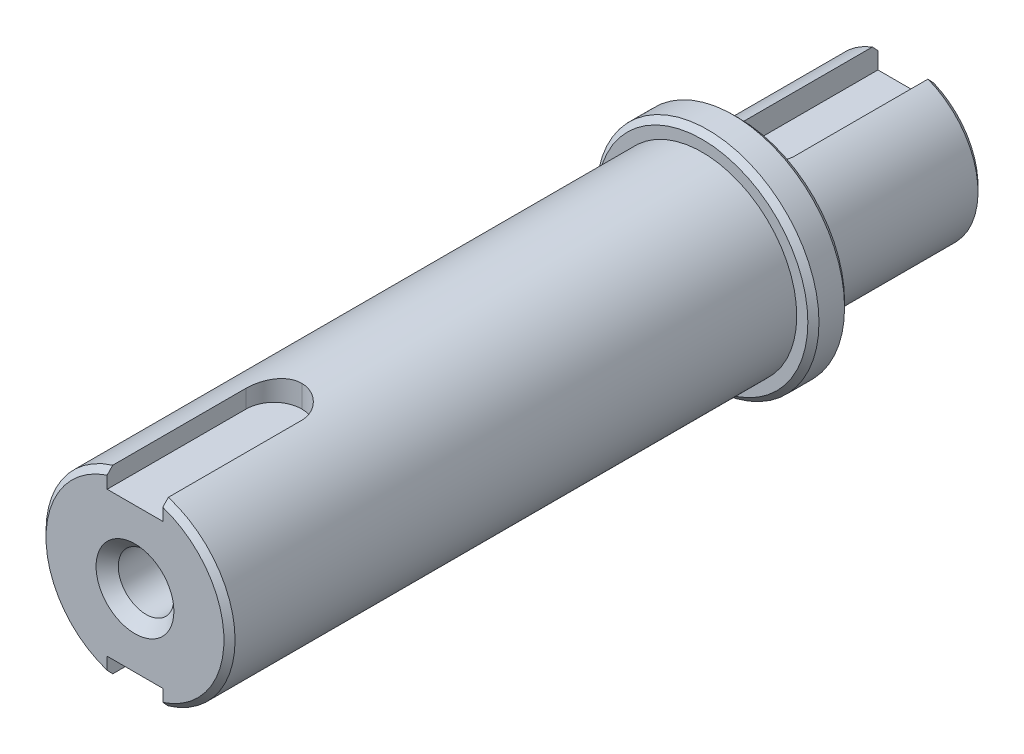
ISO-10303-21;
HEADER;
FILE_DESCRIPTION(('STEP AP214'),'2;1');
FILE_NAME('part.step','',(''),(''),'','','');
FILE_SCHEMA(('AUTOMOTIVE_DESIGN { 1 0 10303 214 1 1 1 1 }'));
ENDSEC;
DATA;
#1=APPLICATION_CONTEXT('core data for automotive mechanical design processes');
#2=APPLICATION_PROTOCOL_DEFINITION('international standard','automotive_design',2000,#1);
#3=PRODUCT_CONTEXT('',#1,'mechanical');
#4=PRODUCT('Part','Part','',(#3));
#5=PRODUCT_RELATED_PRODUCT_CATEGORY('part','',(#4));
#6=PRODUCT_DEFINITION_FORMATION('','',#4);
#7=PRODUCT_DEFINITION_CONTEXT('part definition',#1,'design');
#8=PRODUCT_DEFINITION('design','',#6,#7);
#9=PRODUCT_DEFINITION_SHAPE('','',#8);
#10=(LENGTH_UNIT() NAMED_UNIT(*) SI_UNIT(.MILLI.,.METRE.));
#11=(NAMED_UNIT(*) PLANE_ANGLE_UNIT() SI_UNIT($,.RADIAN.));
#12=(NAMED_UNIT(*) SI_UNIT($,.STERADIAN.) SOLID_ANGLE_UNIT());
#13=UNCERTAINTY_MEASURE_WITH_UNIT(LENGTH_MEASURE(1.E-05),#10,'distance_accuracy_value','');
#14=(GEOMETRIC_REPRESENTATION_CONTEXT(3) GLOBAL_UNCERTAINTY_ASSIGNED_CONTEXT((#13)) GLOBAL_UNIT_ASSIGNED_CONTEXT((#10,
#11,#12)) REPRESENTATION_CONTEXT('',''));
#15=CARTESIAN_POINT('',(0.,0.,0.));
#16=DIRECTION('',(0.,0.,1.));
#17=DIRECTION('',(1.,0.,0.));
#18=AXIS2_PLACEMENT_3D('',#15,#16,#17);
#19=CARTESIAN_POINT('',(0.,0.,69.3));
#20=DIRECTION('',(0.,0.,-1.));
#21=DIRECTION('',(-1.,0.,0.));
#22=AXIS2_PLACEMENT_3D('',#19,#20,#21);
#23=CONICAL_SURFACE('',#22,8.00000000000001,0.785398163397441);
#24=CARTESIAN_POINT('',(2.49999999999992,-10.8696270199437,66.1465793788322));
#25=CARTESIAN_POINT('',(2.49999999999993,-10.636859116482,66.3734218740203));
#26=CARTESIAN_POINT('',(2.49999999999993,-10.4039121897098,66.6000803486522));
#27=CARTESIAN_POINT('',(2.49999999999993,-9.93757307024405,67.0529384229988));
#28=CARTESIAN_POINT('',(2.49999999999993,-9.70418087783187,67.2791380230031));
#29=CARTESIAN_POINT('',(2.49999999999994,-9.00324050594073,67.9568784870172));
#30=CARTESIAN_POINT('',(2.49999999999994,-8.53489331918052,68.4075953844983));
#31=CARTESIAN_POINT('',(2.49999999999995,-7.82982222982861,69.0810369084252));
#32=CARTESIAN_POINT('',(2.49999999999995,-7.59436457285476,69.3050868281361));
#33=CARTESIAN_POINT('',(2.49999999999995,-7.12234637204195,69.7520182988378));
#34=CARTESIAN_POINT('',(2.49999999999995,-6.88578583860562,69.9748998608068));
#35=CARTESIAN_POINT('',(2.49999999999996,-6.41119187258631,70.4191289915092));
#36=CARTESIAN_POINT('',(2.49999999999996,-6.17315832800621,70.6404764408183));
#37=CARTESIAN_POINT('',(2.49999999999996,-5.81461841459231,70.9708892616053));
#38=CARTESIAN_POINT('',(2.49999999999996,-5.69485492358544,71.0807605477859));
#39=CARTESIAN_POINT('',(2.49999999999996,-5.45473492325932,71.2998551079489));
#40=CARTESIAN_POINT('',(2.49999999999996,-5.33437840875386,71.4090783762456));
#41=CARTESIAN_POINT('',(2.49999999999996,-5.21367756830305,71.5179213265275));
#42=B_SPLINE_CURVE_WITH_KNOTS('',3,(#24,#25,#26,#27,#28,#29,#30,#31,#32,#33,#34,#35,#36,#37,#38,
#39,#40,#41),.UNSPECIFIED.,.F.,.F.,(4,2,2,2,2,2,2,2,4),(0.,0.975061231478007,1.95012184704872,
3.90009546224326,4.87515566160608,5.85020668248621,6.82533277310804,7.31291135896617,
7.80049421646795),.UNSPECIFIED.);
#43=CARTESIAN_POINT('',(2.49999999999994,-8.12403840463598,68.8));
#44=VERTEX_POINT('',#43);
#45=CARTESIAN_POINT('',(2.49999999999995,-7.59934207678536,69.3));
#46=VERTEX_POINT('',#45);
#47=EDGE_CURVE('E171',#44,#46,#42,.T.);
#48=ORIENTED_EDGE('',*,*,#47,.F.);
#49=CARTESIAN_POINT('',(0.,0.,68.8));
#50=DIRECTION('',(0.,0.,1.));
#51=DIRECTION('',(1.,0.,0.));
#52=AXIS2_PLACEMENT_3D('',#49,#50,#51);
#53=CIRCLE('',#52,8.5);
#54=CARTESIAN_POINT('',(2.5,8.12403840463596,68.8));
#55=VERTEX_POINT('',#54);
#56=EDGE_CURVE('E328',#55,#44,#53,.F.);
#57=ORIENTED_EDGE('',*,*,#56,.F.);
#58=CARTESIAN_POINT('',(2.5,7.59934207678534,69.3));
#59=CARTESIAN_POINT('',(2.5,7.68691912734198,69.2168006317289));
#60=CARTESIAN_POINT('',(2.5,7.77443234738413,69.1335342801846));
#61=CARTESIAN_POINT('',(2.5,7.94933112332979,68.9668676135132));
#62=CARTESIAN_POINT('',(2.5,8.03671667923785,68.8834672983908));
#63=CARTESIAN_POINT('',(2.5,8.12403840463596,68.8));
#64=B_SPLINE_CURVE_WITH_KNOTS('',3,(#58,#59,#60,#61,#62,#63),.UNSPECIFIED.,.F.,.F.,(4,2,4),(0.,
0.362390177618984,0.724780342351574),.UNSPECIFIED.);
#65=CARTESIAN_POINT('',(2.5,7.59934207678534,69.3));
#66=VERTEX_POINT('',#65);
#67=EDGE_CURVE('E320',#66,#55,#64,.T.);
#68=ORIENTED_EDGE('',*,*,#67,.F.);
#69=CARTESIAN_POINT('',(0.,0.,69.3));
#70=DIRECTION('',(0.,0.,1.));
#71=DIRECTION('',(1.,0.,0.));
#72=AXIS2_PLACEMENT_3D('',#69,#70,#71);
#73=CIRCLE('',#72,8.00000000000001);
#74=EDGE_CURVE('E317',#46,#66,#73,.T.);
#75=ORIENTED_EDGE('',*,*,#74,.F.);
#76=EDGE_LOOP('',(#48,#57,#68,#75));
#77=FACE_BOUND('',#76,.T.);
#78=ADVANCED_FACE('F30',(#77),#23,.T.);
#79=CARTESIAN_POINT('',(0.,0.,15.));
#80=DIRECTION('',(0.,0.,-1.));
#81=DIRECTION('',(-1.,0.,0.));
#82=AXIS2_PLACEMENT_3D('',#79,#80,#81);
#83=CYLINDRICAL_SURFACE('',#82,7.);
#84=DIRECTION('',(0.,0.,-1.));
#85=VECTOR('',#84,1.);
#86=CARTESIAN_POINT('',(-2.5,6.53834841531101,15.));
#87=LINE('',#86,#85);
#88=CARTESIAN_POINT('',(-2.5,6.53834841531101,12.5));
#89=VERTEX_POINT('',#88);
#90=CARTESIAN_POINT('',(-2.5,6.53834841531101,0.499999999999978));
#91=VERTEX_POINT('',#90);
#92=EDGE_CURVE('E198',#89,#91,#87,.T.);
#93=ORIENTED_EDGE('',*,*,#92,.T.);
#94=CARTESIAN_POINT('',(0.,0.,0.499999999999978));
#95=DIRECTION('',(0.,0.,1.));
#96=DIRECTION('',(1.,0.,0.));
#97=AXIS2_PLACEMENT_3D('',#94,#95,#96);
#98=CIRCLE('',#97,7.);
#99=CARTESIAN_POINT('',(2.5,6.53834841531101,0.499999999999979));
#100=VERTEX_POINT('',#99);
#101=EDGE_CURVE('E353',#91,#100,#98,.T.);
#102=ORIENTED_EDGE('',*,*,#101,.T.);
#103=DIRECTION('',(0.,0.,-1.));
#104=VECTOR('',#103,1.);
#105=CARTESIAN_POINT('',(2.5,6.53834841531101,15.));
#106=LINE('',#105,#104);
#107=CARTESIAN_POINT('',(2.5,6.53834841531101,12.5));
#108=VERTEX_POINT('',#107);
#109=EDGE_CURVE('E203',#100,#108,#106,.F.);
#110=ORIENTED_EDGE('',*,*,#109,.T.);
#111=CARTESIAN_POINT('',(2.5,6.53834841531101,12.5));
#112=CARTESIAN_POINT('',(2.50000932444622,6.53833653584086,12.5678917606132));
#113=CARTESIAN_POINT('',(2.49723464622262,6.53940557744183,12.6357769639594));
#114=CARTESIAN_POINT('',(2.48618999898007,6.54361696384382,12.7710139079275));
#115=CARTESIAN_POINT('',(2.47792171332017,6.54675867353285,12.8383658055703));
#116=CARTESIAN_POINT('',(2.455999322543,6.55501308694937,12.9718337089638));
#117=CARTESIAN_POINT('',(2.44236338090026,6.56011914226912,13.0379531031587));
#118=CARTESIAN_POINT('',(2.4098497499207,6.57213229216529,13.1687066391195));
#119=CARTESIAN_POINT('',(2.39097182910556,6.57903946627573,13.2333407151593));
#120=CARTESIAN_POINT('',(2.32674044961539,6.60214905554765,13.4242619951042));
#121=CARTESIAN_POINT('',(2.27375315805254,6.62075405324683,13.5477858370217));
#122=CARTESIAN_POINT('',(2.14911019465095,6.66225312605043,13.7842261337117));
#123=CARTESIAN_POINT('',(2.07744023352399,6.68515048034755,13.8971343788978));
#124=CARTESIAN_POINT('',(1.91402689638811,6.73379882868167,14.1142138816347));
#125=CARTESIAN_POINT('',(1.82158634721561,6.75962796045009,14.2178438888859));
#126=CARTESIAN_POINT('',(1.6207356137859,6.81057540983754,14.4085068277013));
#127=CARTESIAN_POINT('',(1.51232208871062,6.83569357744193,14.495536278427));
#128=CARTESIAN_POINT('',(1.27850282117259,6.88331907970163,14.6531158225099));
#129=CARTESIAN_POINT('',(1.1526765067236,6.90572214958253,14.7230756711259));
#130=CARTESIAN_POINT('',(0.890147396905686,6.94443563272108,14.8405709598355));
#131=CARTESIAN_POINT('',(0.753455692686562,6.96075216451012,14.8881289322678));
#132=CARTESIAN_POINT('',(0.513511625377523,6.98185946377716,14.9488640177156));
#133=CARTESIAN_POINT('',(0.411899416502105,6.98861309237482,14.9679876709647));
#134=CARTESIAN_POINT('',(0.206881971872084,6.99770556810293,14.9935755518822));
#135=CARTESIAN_POINT('',(0.103476366088811,7.0000434929441,15.0000371348884));
#136=CARTESIAN_POINT('',(0.,7.,15.));
#137=B_SPLINE_CURVE_WITH_KNOTS('',3,(#111,#112,#113,#114,#115,#116,#117,#118,#119,#120,#121,
#122,#123,#124,#125,#126,#127,#128,#129,#130,#131,#132,#133,#134,#135,#136),.UNSPECIFIED.,.F.,
.F.,(4,2,2,2,2,2,2,2,2,2,2,2,4),(0.,0.203599169414438,0.407135980434992,0.609989888714329,
0.812852756157981,1.21792365461531,1.62330528194946,2.04515480156738,2.46709267844889,
2.90202857788652,3.33652606938374,3.64653458164688,3.95660783691393),.UNSPECIFIED.);
#138=CARTESIAN_POINT('',(0.,7.,15.));
#139=VERTEX_POINT('',#138);
#140=EDGE_CURVE('E289',#108,#139,#137,.T.);
#141=ORIENTED_EDGE('',*,*,#140,.T.);
#142=CARTESIAN_POINT('',(0.,0.,15.));
#143=DIRECTION('',(0.,0.,1.));
#144=DIRECTION('',(1.,0.,0.));
#145=AXIS2_PLACEMENT_3D('',#142,#143,#144);
#146=CIRCLE('',#145,7.);
#147=EDGE_CURVE('E228',#139,#139,#146,.T.);
#148=ORIENTED_EDGE('',*,*,#147,.F.);
#149=CARTESIAN_POINT('',(0.,7.,15.));
#150=CARTESIAN_POINT('',(-0.0680316354236911,7.00000923760042,15.0000089984849));
#151=CARTESIAN_POINT('',(-0.136057516067307,6.99900844265461,14.997223208249));
#152=CARTESIAN_POINT('',(-0.271584003896383,6.99505559924322,14.9861319263351));
#153=CARTESIAN_POINT('',(-0.33908473954282,6.99210404419495,14.9778278304321));
#154=CARTESIAN_POINT('',(-0.472878818341561,6.98433023755783,14.9558032078577));
#155=CARTESIAN_POINT('',(-0.539175203194543,6.97951368842146,14.94209918989));
#156=CARTESIAN_POINT('',(-0.670285587677925,6.9681457781704,14.9094165109746));
#157=CARTESIAN_POINT('',(-0.735099541349178,6.96159436334944,14.8904376867337));
#158=CARTESIAN_POINT('',(-0.926587541362263,6.93958707549098,14.8258407498535));
#159=CARTESIAN_POINT('',(-1.05049342897248,6.92176667352062,14.7725312192184));
#160=CARTESIAN_POINT('',(-1.28757525627015,6.88161823369573,14.6471333467594));
#161=CARTESIAN_POINT('',(-1.40074458012211,6.85928744272988,14.575033527628));
#162=CARTESIAN_POINT('',(-1.61757767656566,6.81147497344679,14.4111616244424));
#163=CARTESIAN_POINT('',(-1.72077041364006,6.78591039583009,14.3187895778182));
#164=CARTESIAN_POINT('',(-1.91057710564824,6.73493703362114,14.1182607856476));
#165=CARTESIAN_POINT('',(-1.99718536850876,6.70952830540495,14.0100986430393));
#166=CARTESIAN_POINT('',(-2.15426840345264,6.66079107873139,13.7765577279287));
#167=CARTESIAN_POINT('',(-2.22408896193838,6.63756364189772,13.650716146969));
#168=CARTESIAN_POINT('',(-2.34131680574064,6.5971282744709,13.388173322427));
#169=CARTESIAN_POINT('',(-2.38875004413019,6.57991337973655,13.2514848692555));
#170=CARTESIAN_POINT('',(-2.44919145806357,6.55760626901444,13.0118685819719));
#171=CARTESIAN_POINT('',(-2.46818785834143,6.55044807772745,12.9106070935391));
#172=CARTESIAN_POINT('',(-2.49361416582956,6.54079023433991,12.7062565217484));
#173=CARTESIAN_POINT('',(-2.50003810015567,6.53829279648033,12.6031665931968));
#174=CARTESIAN_POINT('',(-2.5,6.53834841531101,12.5));
#175=B_SPLINE_CURVE_WITH_KNOTS('',3,(#149,#150,#151,#152,#153,#154,#155,#156,#157,#158,#159,
#160,#161,#162,#163,#164,#165,#166,#167,#168,#169,#170,#171,#172,#173,#174),.UNSPECIFIED.,.F.,
.F.,(4,2,2,2,2,2,2,2,2,2,2,2,4),(0.,0.204020782660766,0.407989980874049,0.611340380857898,
0.814697076700548,1.220851747484,1.62725508567165,2.04787574926896,2.46864051928115,
2.90381733373915,3.33848841163286,3.64747417056643,3.95660668580006),.UNSPECIFIED.);
#176=EDGE_CURVE('E283',#139,#89,#175,.T.);
#177=ORIENTED_EDGE('',*,*,#176,.T.);
#178=EDGE_LOOP('',(#93,#102,#110,#141,#148,#177));
#179=FACE_BOUND('',#178,.T.);
#180=ADVANCED_FACE('F265',(#179),#83,.T.);
#181=CARTESIAN_POINT('',(0.,0.,18.3));
#182=DIRECTION('',(0.,0.,1.));
#183=DIRECTION('',(1.,0.,0.));
#184=AXIS2_PLACEMENT_3D('',#181,#182,#183);
#185=PLANE('',#184);
#186=CARTESIAN_POINT('',(0.,0.,18.3));
#187=DIRECTION('',(0.,0.,1.));
#188=DIRECTION('',(1.,0.,0.));
#189=AXIS2_PLACEMENT_3D('',#186,#187,#188);
#190=CIRCLE('',#189,9.50000000000002);
#191=CARTESIAN_POINT('',(9.50000000000002,0.,18.3));
#192=VERTEX_POINT('',#191);
#193=EDGE_CURVE('E314',#192,#192,#190,.T.);
#194=ORIENTED_EDGE('',*,*,#193,.T.);
#195=EDGE_LOOP('',(#194));
#196=FACE_BOUND('',#195,.T.);
#197=CARTESIAN_POINT('',(0.,0.,18.3));
#198=DIRECTION('',(0.,0.,1.));
#199=DIRECTION('',(1.,0.,0.));
#200=AXIS2_PLACEMENT_3D('',#197,#198,#199);
#201=CIRCLE('',#200,8.5);
#202=CARTESIAN_POINT('',(8.5,0.,18.3));
#203=VERTEX_POINT('',#202);
#204=EDGE_CURVE('E225',#203,#203,#201,.T.);
#205=ORIENTED_EDGE('',*,*,#204,.F.);
#206=EDGE_LOOP('',(#205));
#207=FACE_BOUND('',#206,.T.);
#208=ADVANCED_FACE('F386',(#196,#207),#185,.T.);
#209=CARTESIAN_POINT('',(0.,0.,0.));
#210=DIRECTION('',(0.,0.,1.));
#211=DIRECTION('',(1.,0.,0.));
#212=AXIS2_PLACEMENT_3D('',#209,#210,#211);
#213=PLANE('',#212);
#214=DIRECTION('',(0.,-1.,0.));
#215=VECTOR('',#214,1.);
#216=CARTESIAN_POINT('',(2.5,6.99999999999987,0.));
#217=LINE('',#216,#215);
#218=CARTESIAN_POINT('',(2.5,6.00000000000002,0.));
#219=VERTEX_POINT('',#218);
#220=CARTESIAN_POINT('',(2.5,4.49999999999987,0.));
#221=VERTEX_POINT('',#220);
#222=EDGE_CURVE('E187',#219,#221,#217,.T.);
#223=ORIENTED_EDGE('',*,*,#222,.F.);
#224=CARTESIAN_POINT('',(0.,0.,0.));
#225=DIRECTION('',(0.,0.,1.));
#226=DIRECTION('',(1.,0.,0.));
#227=AXIS2_PLACEMENT_3D('',#224,#225,#226);
#228=CIRCLE('',#227,6.50000000000002);
#229=CARTESIAN_POINT('',(-2.5,6.00000000000002,0.));
#230=VERTEX_POINT('',#229);
#231=EDGE_CURVE('E362',#219,#230,#228,.F.);
#232=ORIENTED_EDGE('',*,*,#231,.T.);
#233=DIRECTION('',(0.,1.,0.));
#234=VECTOR('',#233,1.);
#235=CARTESIAN_POINT('',(-2.5,6.99999999999987,0.));
#236=LINE('',#235,#234);
#237=CARTESIAN_POINT('',(-2.5,4.49999999999987,0.));
#238=VERTEX_POINT('',#237);
#239=EDGE_CURVE('E192',#238,#230,#236,.T.);
#240=ORIENTED_EDGE('',*,*,#239,.F.);
#241=DIRECTION('',(-1.,0.,0.));
#242=VECTOR('',#241,1.);
#243=CARTESIAN_POINT('',(2.5,4.49999999999987,0.));
#244=LINE('',#243,#242);
#245=EDGE_CURVE('E189',#221,#238,#244,.T.);
#246=ORIENTED_EDGE('',*,*,#245,.F.);
#247=EDGE_LOOP('',(#223,#232,#240,#246));
#248=FACE_BOUND('',#247,.T.);
#249=ADVANCED_FACE('F455',(#248),#213,.F.);
#250=CARTESIAN_POINT('',(0.,0.,15.));
#251=DIRECTION('',(0.,0.,1.));
#252=DIRECTION('',(1.,0.,0.));
#253=AXIS2_PLACEMENT_3D('',#250,#251,#252);
#254=PLANE('',#253);
#255=CARTESIAN_POINT('',(0.,0.,15.));
#256=DIRECTION('',(0.,0.,1.));
#257=DIRECTION('',(1.,0.,0.));
#258=AXIS2_PLACEMENT_3D('',#255,#256,#257);
#259=CIRCLE('',#258,9.50000000000001);
#260=CARTESIAN_POINT('',(9.50000000000001,0.,15.));
#261=VERTEX_POINT('',#260);
#262=EDGE_CURVE('E311',#261,#261,#259,.F.);
#263=ORIENTED_EDGE('',*,*,#262,.T.);
#264=EDGE_LOOP('',(#263));
#265=FACE_BOUND('',#264,.T.);
#266=ORIENTED_EDGE('',*,*,#147,.T.);
#267=EDGE_LOOP('',(#266));
#268=FACE_BOUND('',#267,.T.);
#269=ADVANCED_FACE('F472',(#265,#268),#254,.F.);
#270=CARTESIAN_POINT('',(0.,0.,18.3));
#271=DIRECTION('',(0.,0.,-1.));
#272=DIRECTION('',(-1.,0.,0.));
#273=AXIS2_PLACEMENT_3D('',#270,#271,#272);
#274=CYLINDRICAL_SURFACE('',#273,10.);
#275=CARTESIAN_POINT('',(0.,0.,15.5));
#276=DIRECTION('',(0.,0.,1.));
#277=DIRECTION('',(1.,0.,0.));
#278=AXIS2_PLACEMENT_3D('',#275,#276,#277);
#279=CIRCLE('',#278,10.);
#280=CARTESIAN_POINT('',(10.,0.,15.5));
#281=VERTEX_POINT('',#280);
#282=EDGE_CURVE('E308',#281,#281,#279,.T.);
#283=ORIENTED_EDGE('',*,*,#282,.T.);
#284=EDGE_LOOP('',(#283));
#285=FACE_BOUND('',#284,.T.);
#286=CARTESIAN_POINT('',(0.,0.,17.8));
#287=DIRECTION('',(0.,0.,1.));
#288=DIRECTION('',(1.,0.,0.));
#289=AXIS2_PLACEMENT_3D('',#286,#287,#288);
#290=CIRCLE('',#289,10.);
#291=CARTESIAN_POINT('',(10.,0.,17.8));
#292=VERTEX_POINT('',#291);
#293=EDGE_CURVE('E305',#292,#292,#290,.F.);
#294=ORIENTED_EDGE('',*,*,#293,.T.);
#295=EDGE_LOOP('',(#294));
#296=FACE_BOUND('',#295,.T.);
#297=ADVANCED_FACE('F474',(#285,#296),#274,.T.);
#298=CARTESIAN_POINT('',(0.,0.,69.3));
#299=DIRECTION('',(0.,0.,-1.));
#300=DIRECTION('',(-1.,0.,0.));
#301=AXIS2_PLACEMENT_3D('',#298,#299,#300);
#302=CYLINDRICAL_SURFACE('',#301,8.5);
#303=ORIENTED_EDGE('',*,*,#56,.T.);
#304=DIRECTION('',(0.,0.,-1.));
#305=VECTOR('',#304,1.);
#306=CARTESIAN_POINT('',(2.49999999999994,-8.12403840463598,69.3));
#307=LINE('',#306,#305);
#308=CARTESIAN_POINT('',(2.49999999999994,-8.12403840463598,56.8));
#309=VERTEX_POINT('',#308);
#310=EDGE_CURVE('E184',#44,#309,#307,.T.);
#311=ORIENTED_EDGE('',*,*,#310,.T.);
#312=CARTESIAN_POINT('',(2.49999999999994,-8.12403840463598,56.8));
#313=CARTESIAN_POINT('',(2.50000849686648,-8.12402906771787,56.7313177799408));
#314=CARTESIAN_POINT('',(2.49716980977339,-8.12490917017559,56.6626409512202));
#315=CARTESIAN_POINT('',(2.48586415463097,-8.12837888235339,56.5258101275376));
#316=CARTESIAN_POINT('',(2.47739841144576,-8.13096812003823,56.4576560220573));
#317=CARTESIAN_POINT('',(2.45493310067198,-8.13777817131944,56.3225233392124));
#318=CARTESIAN_POINT('',(2.44094757199488,-8.14199484513058,56.2555422263711));
#319=CARTESIAN_POINT('',(2.40757905179738,-8.15192394629426,56.1230693920344));
#320=CARTESIAN_POINT('',(2.38819592816926,-8.15763641025649,56.0575777070356));
#321=CARTESIAN_POINT('',(2.32218407202307,-8.17677118749585,55.8640554697252));
#322=CARTESIAN_POINT('',(2.26766517405142,-8.19219981533257,55.7388129971012));
#323=CARTESIAN_POINT('',(2.13929064554151,-8.22665338390609,55.499251262459));
#324=CARTESIAN_POINT('',(2.06542586234368,-8.24568002569827,55.3849372057793));
#325=CARTESIAN_POINT('',(1.89805703265728,-8.28582952080898,55.1669787454379));
#326=CARTESIAN_POINT('',(1.80407131969091,-8.30699545861645,55.0637114332229));
#327=CARTESIAN_POINT('',(1.60015367402683,-8.3486718116486,54.8741509131135));
#328=CARTESIAN_POINT('',(1.4902186527275,-8.36918209896486,54.787861000555));
#329=CARTESIAN_POINT('',(1.2548129163222,-8.40773080660074,54.6330470576838));
#330=CARTESIAN_POINT('',(1.12907434855837,-8.42571125601466,54.5649149837069));
#331=CARTESIAN_POINT('',(0.867343934178445,-8.45665570244319,54.4509477914966));
#332=CARTESIAN_POINT('',(0.731360959371843,-8.4696239817328,54.4050936309119));
#333=CARTESIAN_POINT('',(0.495592975132446,-8.48609418920807,54.3475905488857));
#334=CARTESIAN_POINT('',(0.397384905119889,-8.49127589043532,54.3297789772697));
#335=CARTESIAN_POINT('',(0.199470384486984,-8.49824333981208,54.3059724652483));
#336=CARTESIAN_POINT('',(0.099764542587376,-8.5000304318634,54.2999728485389));
#337=CARTESIAN_POINT('',(0.,-8.5,54.3));
#338=B_SPLINE_CURVE_WITH_KNOTS('',3,(#312,#313,#314,#315,#316,#317,#318,#319,#320,#321,#322,
#323,#324,#325,#326,#327,#328,#329,#330,#331,#332,#333,#334,#335,#336,#337),.UNSPECIFIED.,.F.,
.F.,(4,2,2,2,2,2,2,2,2,2,2,2,4),(0.,0.205973189399413,0.411901558456094,0.617309514129545,
0.82272249766488,1.23305291553884,1.6435778150821,2.06532491656567,2.48715379913929,
2.91746144454113,3.3474006286436,3.64650782176597,3.94549657576071),.UNSPECIFIED.);
#339=CARTESIAN_POINT('',(0.,-8.5,54.3));
#340=VERTEX_POINT('',#339);
#341=EDGE_CURVE('E11',#309,#340,#338,.T.);
#342=ORIENTED_EDGE('',*,*,#341,.T.);
#343=CARTESIAN_POINT('',(0.,-8.5,54.3));
#344=CARTESIAN_POINT('',(-0.068747265247265,-8.50000787284103,54.2999916561594));
#345=CARTESIAN_POINT('',(-0.137489506964144,-8.49916614868237,54.3028355682775));
#346=CARTESIAN_POINT('',(-0.274454901554203,-8.49584199541962,54.3141631464925));
#347=CARTESIAN_POINT('',(-0.342678152124615,-8.49335988324837,54.3226457231675));
#348=CARTESIAN_POINT('',(-0.477962289712855,-8.48682119103615,54.345159097056));
#349=CARTESIAN_POINT('',(-0.545025556625634,-8.48276837212453,54.3591766420334));
#350=CARTESIAN_POINT('',(-0.677663893251097,-8.47320492667556,54.3926246708867));
#351=CARTESIAN_POINT('',(-0.743238935488892,-8.4676942732481,54.4120552546079));
#352=CARTESIAN_POINT('',(-0.937023742118018,-8.44918630070089,54.4782391701986));
#353=CARTESIAN_POINT('',(-1.06244291795125,-8.43420525501621,54.5329098420043));
#354=CARTESIAN_POINT('',(-1.30229915575332,-8.40052061068672,54.6616395617042));
#355=CARTESIAN_POINT('',(-1.41673177403394,-8.38181551511401,54.7357064099189));
#356=CARTESIAN_POINT('',(-1.63456801636785,-8.34210677838905,54.9032861062589));
#357=CARTESIAN_POINT('',(-1.73762853009756,-8.32105770252567,54.9972349153975));
#358=CARTESIAN_POINT('',(-1.92678703628758,-8.27930550465338,55.2009922290882));
#359=CARTESIAN_POINT('',(-2.01288069909835,-8.2586024721791,55.3108047694353));
#360=CARTESIAN_POINT('',(-2.16747400127244,-8.21940221182534,55.5460868279043));
#361=CARTESIAN_POINT('',(-2.23554948253299,-8.20096286472919,55.6718453246116));
#362=CARTESIAN_POINT('',(-2.34940414002641,-8.16907684921675,55.933612035668));
#363=CARTESIAN_POINT('',(-2.39520390006598,-8.15562557433037,56.0696106529289));
#364=CARTESIAN_POINT('',(-2.45256835387728,-8.13852091505065,56.305232614504));
#365=CARTESIAN_POINT('',(-2.47031854925295,-8.13312938494048,56.4032668945633));
#366=CARTESIAN_POINT('',(-2.49404649264924,-8.12587057798285,56.6008474507345));
#367=CARTESIAN_POINT('',(-2.50002754122132,-8.12400231307345,56.700393295048));
#368=CARTESIAN_POINT('',(-2.50000000000006,-8.12403840463594,56.8));
#369=B_SPLINE_CURVE_WITH_KNOTS('',3,(#343,#344,#345,#346,#347,#348,#349,#350,#351,#352,#353,
#354,#355,#356,#357,#358,#359,#360,#361,#362,#363,#364,#365,#366,#367,#368),.UNSPECIFIED.,.F.,
.F.,(4,2,2,2,2,2,2,2,2,2,2,2,4),(0.,0.206169232778293,0.412298644059628,0.61793748863417,
0.823580126531086,1.23441505282323,1.6454154539257,2.06658923727844,2.48787035818986,
2.91832935349219,3.34838982528643,3.64698471144029,3.9454958474007),.UNSPECIFIED.);
#370=CARTESIAN_POINT('',(-2.50000000000006,-8.12403840463594,56.8));
#371=VERTEX_POINT('',#370);
#372=EDGE_CURVE('E40',#340,#371,#369,.T.);
#373=ORIENTED_EDGE('',*,*,#372,.T.);
#374=DIRECTION('',(0.,0.,-1.));
#375=VECTOR('',#374,1.);
#376=CARTESIAN_POINT('',(-2.50000000000006,-8.12403840463594,69.3));
#377=LINE('',#376,#375);
#378=CARTESIAN_POINT('',(-2.50000000000006,-8.12403840463594,68.8));
#379=VERTEX_POINT('',#378);
#380=EDGE_CURVE('E181',#371,#379,#377,.F.);
#381=ORIENTED_EDGE('',*,*,#380,.T.);
#382=CARTESIAN_POINT('',(-2.5,8.12403840463596,68.8));
#383=VERTEX_POINT('',#382);
#384=EDGE_CURVE('E327',#379,#383,#53,.F.);
#385=ORIENTED_EDGE('',*,*,#384,.T.);
#386=DIRECTION('',(0.,0.,-1.));
#387=VECTOR('',#386,1.);
#388=CARTESIAN_POINT('',(-2.5,8.12403840463596,69.3));
#389=LINE('',#388,#387);
#390=CARTESIAN_POINT('',(-2.5,8.12403840463596,56.8));
#391=VERTEX_POINT('',#390);
#392=EDGE_CURVE('E223',#383,#391,#389,.T.);
#393=ORIENTED_EDGE('',*,*,#392,.T.);
#394=CARTESIAN_POINT('',(-2.5,8.12403840463596,56.8));
#395=CARTESIAN_POINT('',(-2.50000849686654,8.12402906771785,56.7313177799408));
#396=CARTESIAN_POINT('',(-2.49716980977345,8.12490917017557,56.6626409512202));
#397=CARTESIAN_POINT('',(-2.48586415463103,8.12837888235337,56.5258101275376));
#398=CARTESIAN_POINT('',(-2.47739841144581,8.13096812003822,56.4576560220573));
#399=CARTESIAN_POINT('',(-2.45493310067204,8.13777817131942,56.3225233392124));
#400=CARTESIAN_POINT('',(-2.44094757199494,8.14199484513057,56.2555422263711));
#401=CARTESIAN_POINT('',(-2.40757905179745,8.15192394629424,56.1230693920344));
#402=CARTESIAN_POINT('',(-2.38819592816932,8.15763641025647,56.0575777070356));
#403=CARTESIAN_POINT('',(-2.32218407202312,8.17677118749583,55.8640554697252));
#404=CARTESIAN_POINT('',(-2.26766517405147,8.19219981533255,55.7388129971012));
#405=CARTESIAN_POINT('',(-2.13929064554157,8.22665338390607,55.499251262459));
#406=CARTESIAN_POINT('',(-2.06542586234374,8.24568002569826,55.3849372057793));
#407=CARTESIAN_POINT('',(-1.89805703265734,8.28582952080896,55.1669787454379));
#408=CARTESIAN_POINT('',(-1.80407131969097,8.30699545861643,55.0637114332229));
#409=CARTESIAN_POINT('',(-1.60015367402689,8.34867181164859,54.8741509131135));
#410=CARTESIAN_POINT('',(-1.49021865272756,8.36918209896485,54.787861000555));
#411=CARTESIAN_POINT('',(-1.25481291632226,8.40773080660073,54.6330470576838));
#412=CARTESIAN_POINT('',(-1.12907434855843,8.42571125601465,54.5649149837069));
#413=CARTESIAN_POINT('',(-0.867343934178504,8.45665570244319,54.4509477914966));
#414=CARTESIAN_POINT('',(-0.731360959371902,8.46962398173279,54.4050936309119));
#415=CARTESIAN_POINT('',(-0.495592975132505,8.48609418920806,54.3475905488857));
#416=CARTESIAN_POINT('',(-0.397384905119949,8.49127589043532,54.3297789772697));
#417=CARTESIAN_POINT('',(-0.199470384487044,8.49824333981208,54.3059724652483));
#418=CARTESIAN_POINT('',(-0.0997645425874354,8.5000304318634,54.2999728485389));
#419=CARTESIAN_POINT('',(0.,8.5,54.3));
#420=B_SPLINE_CURVE_WITH_KNOTS('',3,(#394,#395,#396,#397,#398,#399,#400,#401,#402,#403,#404,
#405,#406,#407,#408,#409,#410,#411,#412,#413,#414,#415,#416,#417,#418,#419),.UNSPECIFIED.,.F.,
.F.,(4,2,2,2,2,2,2,2,2,2,2,2,4),(0.,0.205973189399406,0.411901558456087,0.61730951412953,
0.82272249766488,1.23305291553884,1.6435778150821,2.06532491656567,2.48715379913929,
2.91746144454113,3.3474006286436,3.64650782176597,3.94549657576071),.UNSPECIFIED.);
#421=CARTESIAN_POINT('',(0.,8.5,54.3));
#422=VERTEX_POINT('',#421);
#423=EDGE_CURVE('E241',#391,#422,#420,.T.);
#424=ORIENTED_EDGE('',*,*,#423,.T.);
#425=CARTESIAN_POINT('',(0.,8.5,54.3));
#426=CARTESIAN_POINT('',(0.0687472652472055,8.50000787284103,54.2999916561594));
#427=CARTESIAN_POINT('',(0.137489506964084,8.49916614868237,54.3028355682775));
#428=CARTESIAN_POINT('',(0.274454901554143,8.49584199541962,54.3141631464925));
#429=CARTESIAN_POINT('',(0.342678152124556,8.49335988324838,54.3226457231675));
#430=CARTESIAN_POINT('',(0.477962289712796,8.48682119103615,54.345159097056));
#431=CARTESIAN_POINT('',(0.545025556625576,8.48276837212453,54.3591766420334));
#432=CARTESIAN_POINT('',(0.677663893251039,8.47320492667556,54.3926246708867));
#433=CARTESIAN_POINT('',(0.743238935488834,8.46769427324811,54.4120552546079));
#434=CARTESIAN_POINT('',(0.937023742117959,8.44918630070089,54.4782391701986));
#435=CARTESIAN_POINT('',(1.06244291795119,8.43420525501622,54.5329098420043));
#436=CARTESIAN_POINT('',(1.30229915575326,8.40052061068674,54.6616395617042));
#437=CARTESIAN_POINT('',(1.41673177403388,8.38181551511402,54.7357064099189));
#438=CARTESIAN_POINT('',(1.63456801636779,8.34210677838906,54.9032861062589));
#439=CARTESIAN_POINT('',(1.73762853009751,8.32105770252569,54.9972349153975));
#440=CARTESIAN_POINT('',(1.92678703628753,8.27930550465339,55.2009922290882));
#441=CARTESIAN_POINT('',(2.0128806990983,8.25860247217912,55.3108047694353));
#442=CARTESIAN_POINT('',(2.16747400127239,8.21940221182536,55.5460868279043));
#443=CARTESIAN_POINT('',(2.23554948253293,8.20096286472921,55.6718453246116));
#444=CARTESIAN_POINT('',(2.34940414002635,8.16907684921677,55.933612035668));
#445=CARTESIAN_POINT('',(2.39520390006592,8.15562557433039,56.0696106529289));
#446=CARTESIAN_POINT('',(2.45256835387722,8.13852091505067,56.305232614504));
#447=CARTESIAN_POINT('',(2.47031854925289,8.1331293849405,56.4032668945633));
#448=CARTESIAN_POINT('',(2.49404649264919,8.12587057798286,56.6008474507345));
#449=CARTESIAN_POINT('',(2.50002754122126,8.12400231307346,56.700393295048));
#450=CARTESIAN_POINT('',(2.5,8.12403840463596,56.8));
#451=B_SPLINE_CURVE_WITH_KNOTS('',3,(#425,#426,#427,#428,#429,#430,#431,#432,#433,#434,#435,
#436,#437,#438,#439,#440,#441,#442,#443,#444,#445,#446,#447,#448,#449,#450),.UNSPECIFIED.,.F.,
.F.,(4,2,2,2,2,2,2,2,2,2,2,2,4),(0.,0.206169232778293,0.412298644059628,0.617937488634172,
0.823580126531086,1.23441505282323,1.6454154539257,2.06658923727844,2.48787035818986,
2.91832935349219,3.34838982528643,3.64698471144031,3.9454958474007),.UNSPECIFIED.);
#452=CARTESIAN_POINT('',(2.5,8.12403840463596,56.8));
#453=VERTEX_POINT('',#452);
#454=EDGE_CURVE('E248',#422,#453,#451,.T.);
#455=ORIENTED_EDGE('',*,*,#454,.T.);
#456=DIRECTION('',(0.,0.,-1.));
#457=VECTOR('',#456,1.);
#458=CARTESIAN_POINT('',(2.5,8.12403840463596,69.3));
#459=LINE('',#458,#457);
#460=EDGE_CURVE('E218',#453,#55,#459,.F.);
#461=ORIENTED_EDGE('',*,*,#460,.T.);
#462=EDGE_LOOP('',(#303,#311,#342,#373,#381,#385,#393,#424,#455,#461));
#463=FACE_BOUND('',#462,.T.);
#464=ORIENTED_EDGE('',*,*,#204,.T.);
#465=EDGE_LOOP('',(#464));
#466=FACE_BOUND('',#465,.T.);
#467=ADVANCED_FACE('F254',(#463,#466),#302,.T.);
#468=CARTESIAN_POINT('',(0.,0.,69.3));
#469=DIRECTION('',(0.,0.,1.));
#470=DIRECTION('',(1.,0.,0.));
#471=AXIS2_PLACEMENT_3D('',#468,#469,#470);
#472=PLANE('',#471);
#473=DIRECTION('',(0.,1.,0.));
#474=VECTOR('',#473,1.);
#475=CARTESIAN_POINT('',(2.49999999999994,-9.12601010101012,69.3));
#476=LINE('',#475,#474);
#477=CARTESIAN_POINT('',(2.49999999999995,-6.50000000000002,69.3));
#478=VERTEX_POINT('',#477);
#479=EDGE_CURVE('E168',#46,#478,#476,.T.);
#480=ORIENTED_EDGE('',*,*,#479,.F.);
#481=ORIENTED_EDGE('',*,*,#74,.T.);
#482=DIRECTION('',(0.,1.,0.));
#483=VECTOR('',#482,1.);
#484=CARTESIAN_POINT('',(2.5,9.1260101010101,69.3));
#485=LINE('',#484,#483);
#486=CARTESIAN_POINT('',(2.5,6.5,69.3));
#487=VERTEX_POINT('',#486);
#488=EDGE_CURVE('E212',#487,#66,#485,.T.);
#489=ORIENTED_EDGE('',*,*,#488,.F.);
#490=DIRECTION('',(1.,0.,0.));
#491=VECTOR('',#490,1.);
#492=CARTESIAN_POINT('',(-2.5,6.5,69.3));
#493=LINE('',#492,#491);
#494=CARTESIAN_POINT('',(-2.5,6.5,69.3));
#495=VERTEX_POINT('',#494);
#496=EDGE_CURVE('E209',#495,#487,#493,.T.);
#497=ORIENTED_EDGE('',*,*,#496,.F.);
#498=DIRECTION('',(0.,-1.,0.));
#499=VECTOR('',#498,1.);
#500=CARTESIAN_POINT('',(-2.5,0.,69.3));
#501=LINE('',#500,#499);
#502=CARTESIAN_POINT('',(-2.5,7.59934207678534,69.3));
#503=VERTEX_POINT('',#502);
#504=EDGE_CURVE('E230',#503,#495,#501,.T.);
#505=ORIENTED_EDGE('',*,*,#504,.F.);
#506=CARTESIAN_POINT('',(-2.50000000000005,-7.59934207678532,69.3));
#507=VERTEX_POINT('',#506);
#508=EDGE_CURVE('E318',#503,#507,#73,.T.);
#509=ORIENTED_EDGE('',*,*,#508,.T.);
#510=DIRECTION('',(0.,-1.,0.));
#511=VECTOR('',#510,1.);
#512=CARTESIAN_POINT('',(-2.50000000000006,-9.12601010101009,69.3));
#513=LINE('',#512,#511);
#514=CARTESIAN_POINT('',(-2.50000000000005,-6.49999999999998,69.3));
#515=VERTEX_POINT('',#514);
#516=EDGE_CURVE('E165',#515,#507,#513,.T.);
#517=ORIENTED_EDGE('',*,*,#516,.F.);
#518=DIRECTION('',(-1.,0.,0.));
#519=VECTOR('',#518,1.);
#520=CARTESIAN_POINT('',(2.49999999999995,-6.50000000000002,69.3));
#521=LINE('',#520,#519);
#522=EDGE_CURVE('E160',#478,#515,#521,.T.);
#523=ORIENTED_EDGE('',*,*,#522,.F.);
#524=EDGE_LOOP('',(#480,#481,#489,#497,#505,#509,#517,#523));
#525=FACE_BOUND('',#524,.T.);
#526=CARTESIAN_POINT('',(0.,0.,69.3));
#527=DIRECTION('',(0.,0.,1.));
#528=DIRECTION('',(1.,0.,0.));
#529=AXIS2_PLACEMENT_3D('',#526,#527,#528);
#530=CIRCLE('',#529,3.5);
#531=CARTESIAN_POINT('',(3.5,0.,69.3));
#532=VERTEX_POINT('',#531);
#533=EDGE_CURVE('E302',#532,#532,#530,.F.);
#534=ORIENTED_EDGE('',*,*,#533,.T.);
#535=EDGE_LOOP('',(#534));
#536=FACE_BOUND('',#535,.T.);
#537=ADVANCED_FACE('F175',(#525,#536),#472,.T.);
#538=CARTESIAN_POINT('',(-2.5,9.1260101010101,54.3));
#539=DIRECTION('',(-1.,0.,0.));
#540=DIRECTION('',(0.,-1.,0.));
#541=AXIS2_PLACEMENT_3D('',#538,#539,#540);
#542=PLANE('',#541);
#543=ORIENTED_EDGE('',*,*,#392,.F.);
#544=CARTESIAN_POINT('',(-2.5,8.12403840463596,68.8));
#545=CARTESIAN_POINT('',(-2.5,8.03671667923785,68.8834672983908));
#546=CARTESIAN_POINT('',(-2.5,7.94933112332979,68.9668676135132));
#547=CARTESIAN_POINT('',(-2.5,7.77443234738413,69.1335342801846));
#548=CARTESIAN_POINT('',(-2.5,7.68691912734198,69.2168006317289));
#549=CARTESIAN_POINT('',(-2.5,7.59934207678534,69.3));
#550=B_SPLINE_CURVE_WITH_KNOTS('',3,(#544,#545,#546,#547,#548,#549),.UNSPECIFIED.,.F.,.F.,(4,2,
4),(0.,0.362390164732594,0.724780342351578),.UNSPECIFIED.);
#551=EDGE_CURVE('E348',#383,#503,#550,.T.);
#552=ORIENTED_EDGE('',*,*,#551,.T.);
#553=ORIENTED_EDGE('',*,*,#504,.T.);
#554=DIRECTION('',(0.,0.,1.));
#555=VECTOR('',#554,1.);
#556=CARTESIAN_POINT('',(-2.5,6.5,54.3));
#557=LINE('',#556,#555);
#558=CARTESIAN_POINT('',(-2.5,6.5,56.8));
#559=VERTEX_POINT('',#558);
#560=EDGE_CURVE('E215',#559,#495,#557,.T.);
#561=ORIENTED_EDGE('',*,*,#560,.F.);
#562=DIRECTION('',(0.,-1.,0.));
#563=VECTOR('',#562,1.);
#564=CARTESIAN_POINT('',(-2.5,9.1260101010101,56.8));
#565=LINE('',#564,#563);
#566=EDGE_CURVE('E236',#559,#391,#565,.F.);
#567=ORIENTED_EDGE('',*,*,#566,.T.);
#568=EDGE_LOOP('',(#543,#552,#553,#561,#567));
#569=FACE_BOUND('',#568,.T.);
#570=ADVANCED_FACE('F339',(#569),#542,.F.);
#571=CARTESIAN_POINT('',(2.5,9.1260101010101,54.3));
#572=DIRECTION('',(1.,0.,0.));
#573=DIRECTION('',(0.,1.,0.));
#574=AXIS2_PLACEMENT_3D('',#571,#572,#573);
#575=PLANE('',#574);
#576=ORIENTED_EDGE('',*,*,#488,.T.);
#577=ORIENTED_EDGE('',*,*,#67,.T.);
#578=ORIENTED_EDGE('',*,*,#460,.F.);
#579=DIRECTION('',(0.,1.,0.));
#580=VECTOR('',#579,1.);
#581=CARTESIAN_POINT('',(2.5,9.1260101010101,56.8));
#582=LINE('',#581,#580);
#583=CARTESIAN_POINT('',(2.5,6.5,56.8));
#584=VERTEX_POINT('',#583);
#585=EDGE_CURVE('E239',#453,#584,#582,.F.);
#586=ORIENTED_EDGE('',*,*,#585,.T.);
#587=DIRECTION('',(0.,0.,1.));
#588=VECTOR('',#587,1.);
#589=CARTESIAN_POINT('',(2.5,6.5,54.3));
#590=LINE('',#589,#588);
#591=EDGE_CURVE('E216',#584,#487,#590,.T.);
#592=ORIENTED_EDGE('',*,*,#591,.T.);
#593=EDGE_LOOP('',(#576,#577,#578,#586,#592));
#594=FACE_BOUND('',#593,.T.);
#595=ADVANCED_FACE('F334',(#594),#575,.F.);
#596=CARTESIAN_POINT('',(-2.5,6.5,54.3));
#597=DIRECTION('',(0.,-1.,0.));
#598=DIRECTION('',(0.,0.,-1.));
#599=AXIS2_PLACEMENT_3D('',#596,#597,#598);
#600=PLANE('',#599);
#601=CARTESIAN_POINT('',(0.,6.5,56.8));
#602=DIRECTION('',(0.,-1.,0.));
#603=DIRECTION('',(0.,0.,-1.));
#604=AXIS2_PLACEMENT_3D('',#601,#602,#603);
#605=CIRCLE('',#604,2.5);
#606=CARTESIAN_POINT('',(0.,6.5,54.3));
#607=VERTEX_POINT('',#606);
#608=EDGE_CURVE('E232',#584,#607,#605,.F.);
#609=ORIENTED_EDGE('',*,*,#608,.T.);
#610=CARTESIAN_POINT('',(0.,6.5,56.8));
#611=DIRECTION('',(0.,-1.,0.));
#612=DIRECTION('',(0.,0.,-1.));
#613=AXIS2_PLACEMENT_3D('',#610,#611,#612);
#614=CIRCLE('',#613,2.5);
#615=EDGE_CURVE('E234',#607,#559,#614,.F.);
#616=ORIENTED_EDGE('',*,*,#615,.T.);
#617=ORIENTED_EDGE('',*,*,#560,.T.);
#618=ORIENTED_EDGE('',*,*,#496,.T.);
#619=ORIENTED_EDGE('',*,*,#591,.F.);
#620=EDGE_LOOP('',(#609,#616,#617,#618,#619));
#621=FACE_BOUND('',#620,.T.);
#622=ADVANCED_FACE('F271',(#621),#600,.F.);
#623=CARTESIAN_POINT('',(0.,6.5,56.8));
#624=DIRECTION('',(0.,1.,0.));
#625=DIRECTION('',(-1.,0.,0.));
#626=AXIS2_PLACEMENT_3D('',#623,#624,#625);
#627=CYLINDRICAL_SURFACE('',#626,2.5);
#628=ORIENTED_EDGE('',*,*,#585,.F.);
#629=ORIENTED_EDGE('',*,*,#454,.F.);
#630=DIRECTION('',(0.,1.,0.));
#631=VECTOR('',#630,1.);
#632=CARTESIAN_POINT('',(0.,6.5,54.3));
#633=LINE('',#632,#631);
#634=EDGE_CURVE('E208',#607,#422,#633,.T.);
#635=ORIENTED_EDGE('',*,*,#634,.F.);
#636=ORIENTED_EDGE('',*,*,#608,.F.);
#637=EDGE_LOOP('',(#628,#629,#635,#636));
#638=FACE_BOUND('',#637,.T.);
#639=ADVANCED_FACE('F263',(#638),#627,.F.);
#640=CARTESIAN_POINT('',(0.,6.5,56.8));
#641=DIRECTION('',(0.,-1.,0.));
#642=DIRECTION('',(1.,0.,0.));
#643=AXIS2_PLACEMENT_3D('',#640,#641,#642);
#644=CYLINDRICAL_SURFACE('',#643,2.5);
#645=ORIENTED_EDGE('',*,*,#423,.F.);
#646=ORIENTED_EDGE('',*,*,#566,.F.);
#647=ORIENTED_EDGE('',*,*,#615,.F.);
#648=ORIENTED_EDGE('',*,*,#634,.T.);
#649=EDGE_LOOP('',(#645,#646,#647,#648));
#650=FACE_BOUND('',#649,.T.);
#651=ADVANCED_FACE('F258',(#650),#644,.F.);
#652=CARTESIAN_POINT('',(0.,0.,54.3));
#653=DIRECTION('',(0.,0.,1.));
#654=DIRECTION('',(1.,0.,0.));
#655=AXIS2_PLACEMENT_3D('',#652,#653,#654);
#656=CYLINDRICAL_SURFACE('',#655,2.5);
#657=CARTESIAN_POINT('',(0.,0.,68.3));
#658=DIRECTION('',(0.,0.,1.));
#659=DIRECTION('',(1.,0.,0.));
#660=AXIS2_PLACEMENT_3D('',#657,#658,#659);
#661=CIRCLE('',#660,2.5);
#662=CARTESIAN_POINT('',(2.5,0.,68.3));
#663=VERTEX_POINT('',#662);
#664=EDGE_CURVE('E297',#663,#663,#661,.T.);
#665=ORIENTED_EDGE('',*,*,#664,.T.);
#666=EDGE_LOOP('',(#665));
#667=FACE_BOUND('',#666,.T.);
#668=CARTESIAN_POINT('',(0.,0.,54.3));
#669=DIRECTION('',(0.,0.,1.));
#670=DIRECTION('',(1.,0.,0.));
#671=AXIS2_PLACEMENT_3D('',#668,#669,#670);
#672=CIRCLE('',#671,2.5);
#673=CARTESIAN_POINT('',(2.5,0.,54.3));
#674=VERTEX_POINT('',#673);
#675=EDGE_CURVE('E205',#674,#674,#672,.T.);
#676=ORIENTED_EDGE('',*,*,#675,.F.);
#677=EDGE_LOOP('',(#676));
#678=FACE_BOUND('',#677,.T.);
#679=ADVANCED_FACE('F262',(#667,#678),#656,.F.);
#680=CARTESIAN_POINT('',(0.,0.,54.3));
#681=DIRECTION('',(0.,0.,1.));
#682=DIRECTION('',(1.,0.,0.));
#683=AXIS2_PLACEMENT_3D('',#680,#681,#682);
#684=PLANE('',#683);
#685=ORIENTED_EDGE('',*,*,#675,.T.);
#686=EDGE_LOOP('',(#685));
#687=FACE_BOUND('',#686,.T.);
#688=ADVANCED_FACE('F371',(#687),#684,.T.);
#689=CARTESIAN_POINT('',(2.5,6.99999999999986,15.));
#690=DIRECTION('',(1.,0.,0.));
#691=DIRECTION('',(0.,1.,0.));
#692=AXIS2_PLACEMENT_3D('',#689,#690,#691);
#693=PLANE('',#692);
#694=ORIENTED_EDGE('',*,*,#109,.F.);
#695=CARTESIAN_POINT('',(2.5,6.53834841531101,0.499999999999978));
#696=CARTESIAN_POINT('',(2.5,6.44886881436809,0.416402745069062));
#697=CARTESIAN_POINT('',(2.5,6.35926664955849,0.332937454264924));
#698=CARTESIAN_POINT('',(2.5,6.17981717782744,0.16627078755597));
#699=CARTESIAN_POINT('',(2.5,6.08996987086671,0.0830694116934481));
#700=CARTESIAN_POINT('',(2.5,6.00000000000002,0.));
#701=B_SPLINE_CURVE_WITH_KNOTS('',3,(#695,#696,#697,#698,#699,#700),.UNSPECIFIED.,.F.,.F.,(4,2,
4),(0.,0.367362252236514,0.734724563343137),.UNSPECIFIED.);
#702=EDGE_CURVE('E356',#100,#219,#701,.T.);
#703=ORIENTED_EDGE('',*,*,#702,.T.);
#704=ORIENTED_EDGE('',*,*,#222,.T.);
#705=DIRECTION('',(0.,0.,-1.));
#706=VECTOR('',#705,1.);
#707=CARTESIAN_POINT('',(2.5,4.49999999999986,15.));
#708=LINE('',#707,#706);
#709=CARTESIAN_POINT('',(2.5,4.49999999999986,12.5));
#710=VERTEX_POINT('',#709);
#711=EDGE_CURVE('E195',#710,#221,#708,.T.);
#712=ORIENTED_EDGE('',*,*,#711,.F.);
#713=DIRECTION('',(0.,-1.,0.));
#714=VECTOR('',#713,1.);
#715=CARTESIAN_POINT('',(2.5,6.53834841531101,12.5));
#716=LINE('',#715,#714);
#717=EDGE_CURVE('E290',#710,#108,#716,.F.);
#718=ORIENTED_EDGE('',*,*,#717,.T.);
#719=EDGE_LOOP('',(#694,#703,#704,#712,#718));
#720=FACE_BOUND('',#719,.T.);
#721=ADVANCED_FACE('F366',(#720),#693,.F.);
#722=CARTESIAN_POINT('',(-2.5,6.99999999999986,15.));
#723=DIRECTION('',(-1.,0.,0.));
#724=DIRECTION('',(0.,-1.,0.));
#725=AXIS2_PLACEMENT_3D('',#722,#723,#724);
#726=PLANE('',#725);
#727=ORIENTED_EDGE('',*,*,#239,.T.);
#728=CARTESIAN_POINT('',(-2.5,6.00000000000002,0.));
#729=CARTESIAN_POINT('',(-2.5,6.08996987086671,0.0830694116934483));
#730=CARTESIAN_POINT('',(-2.5,6.17981717782743,0.16627078755597));
#731=CARTESIAN_POINT('',(-2.5,6.35926664955848,0.332937454264924));
#732=CARTESIAN_POINT('',(-2.5,6.44886881436809,0.416402745069062));
#733=CARTESIAN_POINT('',(-2.5,6.53834841531101,0.499999999999978));
#734=B_SPLINE_CURVE_WITH_KNOTS('',3,(#728,#729,#730,#731,#732,#733),.UNSPECIFIED.,.F.,.F.,(4,2,
4),(0.,0.367362311106623,0.734724563343138),.UNSPECIFIED.);
#735=EDGE_CURVE('E406',#230,#91,#734,.T.);
#736=ORIENTED_EDGE('',*,*,#735,.T.);
#737=ORIENTED_EDGE('',*,*,#92,.F.);
#738=DIRECTION('',(0.,1.,0.));
#739=VECTOR('',#738,1.);
#740=CARTESIAN_POINT('',(-2.5,4.49999999999986,12.5));
#741=LINE('',#740,#739);
#742=CARTESIAN_POINT('',(-2.5,4.49999999999986,12.5));
#743=VERTEX_POINT('',#742);
#744=EDGE_CURVE('E701',#89,#743,#741,.F.);
#745=ORIENTED_EDGE('',*,*,#744,.T.);
#746=DIRECTION('',(0.,0.,-1.));
#747=VECTOR('',#746,1.);
#748=CARTESIAN_POINT('',(-2.5,4.49999999999986,15.));
#749=LINE('',#748,#747);
#750=EDGE_CURVE('E196',#743,#238,#749,.T.);
#751=ORIENTED_EDGE('',*,*,#750,.T.);
#752=EDGE_LOOP('',(#727,#736,#737,#745,#751));
#753=FACE_BOUND('',#752,.T.);
#754=ADVANCED_FACE('F370',(#753),#726,.F.);
#755=CARTESIAN_POINT('',(2.5,4.49999999999986,15.));
#756=DIRECTION('',(0.,-1.,0.));
#757=DIRECTION('',(0.,0.,-1.));
#758=AXIS2_PLACEMENT_3D('',#755,#756,#757);
#759=PLANE('',#758);
#760=ORIENTED_EDGE('',*,*,#750,.F.);
#761=CARTESIAN_POINT('',(0.,4.49999999999986,12.5));
#762=DIRECTION('',(0.,-1.,0.));
#763=DIRECTION('',(0.,0.,-1.));
#764=AXIS2_PLACEMENT_3D('',#761,#762,#763);
#765=CIRCLE('',#764,2.5);
#766=CARTESIAN_POINT('',(0.,4.49999999999986,15.));
#767=VERTEX_POINT('',#766);
#768=EDGE_CURVE('E467',#743,#767,#765,.F.);
#769=ORIENTED_EDGE('',*,*,#768,.T.);
#770=CARTESIAN_POINT('',(0.,4.49999999999986,12.5));
#771=DIRECTION('',(0.,-1.,0.));
#772=DIRECTION('',(0.,0.,-1.));
#773=AXIS2_PLACEMENT_3D('',#770,#771,#772);
#774=CIRCLE('',#773,2.5);
#775=EDGE_CURVE('E700',#767,#710,#774,.F.);
#776=ORIENTED_EDGE('',*,*,#775,.T.);
#777=ORIENTED_EDGE('',*,*,#711,.T.);
#778=ORIENTED_EDGE('',*,*,#245,.T.);
#779=EDGE_LOOP('',(#760,#769,#776,#777,#778));
#780=FACE_BOUND('',#779,.T.);
#781=ADVANCED_FACE('F373',(#780),#759,.F.);
#782=CARTESIAN_POINT('',(0.,0.,12.5));
#783=DIRECTION('',(0.,1.,0.));
#784=DIRECTION('',(-1.,0.,0.));
#785=AXIS2_PLACEMENT_3D('',#782,#783,#784);
#786=CYLINDRICAL_SURFACE('',#785,2.5);
#787=ORIENTED_EDGE('',*,*,#717,.F.);
#788=ORIENTED_EDGE('',*,*,#775,.F.);
#789=DIRECTION('',(0.,-1.,0.));
#790=VECTOR('',#789,1.);
#791=CARTESIAN_POINT('',(0.,4.49999999999986,15.));
#792=LINE('',#791,#790);
#793=EDGE_CURVE('E186',#139,#767,#792,.T.);
#794=ORIENTED_EDGE('',*,*,#793,.F.);
#795=ORIENTED_EDGE('',*,*,#140,.F.);
#796=EDGE_LOOP('',(#787,#788,#794,#795));
#797=FACE_BOUND('',#796,.T.);
#798=ADVANCED_FACE('F278',(#797),#786,.F.);
#799=CARTESIAN_POINT('',(0.,0.,12.5));
#800=DIRECTION('',(0.,-1.,0.));
#801=DIRECTION('',(1.,0.,0.));
#802=AXIS2_PLACEMENT_3D('',#799,#800,#801);
#803=CYLINDRICAL_SURFACE('',#802,2.5);
#804=ORIENTED_EDGE('',*,*,#768,.F.);
#805=ORIENTED_EDGE('',*,*,#744,.F.);
#806=ORIENTED_EDGE('',*,*,#176,.F.);
#807=ORIENTED_EDGE('',*,*,#793,.T.);
#808=EDGE_LOOP('',(#804,#805,#806,#807));
#809=FACE_BOUND('',#808,.T.);
#810=ADVANCED_FACE('F273',(#809),#803,.F.);
#811=CARTESIAN_POINT('',(0.,0.,68.3));
#812=DIRECTION('',(0.,0.,1.));
#813=DIRECTION('',(1.,0.,0.));
#814=AXIS2_PLACEMENT_3D('',#811,#812,#813);
#815=CONICAL_SURFACE('',#814,2.5,0.785398163397449);
#816=ORIENTED_EDGE('',*,*,#533,.F.);
#817=EDGE_LOOP('',(#816));
#818=FACE_BOUND('',#817,.T.);
#819=ORIENTED_EDGE('',*,*,#664,.F.);
#820=EDGE_LOOP('',(#819));
#821=FACE_BOUND('',#820,.T.);
#822=ADVANCED_FACE('F277',(#818,#821),#815,.F.);
#823=CARTESIAN_POINT('',(0.,0.,15.5));
#824=DIRECTION('',(0.,0.,1.));
#825=DIRECTION('',(1.,0.,0.));
#826=AXIS2_PLACEMENT_3D('',#823,#824,#825);
#827=CONICAL_SURFACE('',#826,10.,0.785398163397453);
#828=ORIENTED_EDGE('',*,*,#262,.F.);
#829=EDGE_LOOP('',(#828));
#830=FACE_BOUND('',#829,.T.);
#831=ORIENTED_EDGE('',*,*,#282,.F.);
#832=EDGE_LOOP('',(#831));
#833=FACE_BOUND('',#832,.T.);
#834=ADVANCED_FACE('F396',(#830,#833),#827,.T.);
#835=CARTESIAN_POINT('',(0.,0.,18.3));
#836=DIRECTION('',(0.,0.,-1.));
#837=DIRECTION('',(-1.,0.,0.));
#838=AXIS2_PLACEMENT_3D('',#835,#836,#837);
#839=CONICAL_SURFACE('',#838,9.50000000000002,0.785398163397443);
#840=ORIENTED_EDGE('',*,*,#293,.F.);
#841=EDGE_LOOP('',(#840));
#842=FACE_BOUND('',#841,.T.);
#843=ORIENTED_EDGE('',*,*,#193,.F.);
#844=EDGE_LOOP('',(#843));
#845=FACE_BOUND('',#844,.T.);
#846=ADVANCED_FACE('F389',(#842,#845),#839,.T.);
#847=CARTESIAN_POINT('',(-2.50000000000004,-5.21367756830299,71.5179213265275));
#848=CARTESIAN_POINT('',(-2.50000000000004,-5.33437840875379,71.4090783762456));
#849=CARTESIAN_POINT('',(-2.50000000000004,-5.45473492325926,71.2998551079489));
#850=CARTESIAN_POINT('',(-2.50000000000004,-5.69485492358539,71.0807605477859));
#851=CARTESIAN_POINT('',(-2.50000000000004,-5.81461841459226,70.9708892616053));
#852=CARTESIAN_POINT('',(-2.50000000000004,-6.17315832800618,70.6404764408184));
#853=CARTESIAN_POINT('',(-2.50000000000004,-6.41119187258628,70.4191289915092));
#854=CARTESIAN_POINT('',(-2.50000000000005,-6.88578583860559,69.9748998608068));
#855=CARTESIAN_POINT('',(-2.50000000000005,-7.12234637204194,69.7520182988378));
#856=CARTESIAN_POINT('',(-2.50000000000005,-7.59436457285475,69.3050868281361));
#857=CARTESIAN_POINT('',(-2.50000000000005,-7.8298222298286,69.0810369084252));
#858=CARTESIAN_POINT('',(-2.50000000000006,-8.5348933191805,68.4075953844983));
#859=CARTESIAN_POINT('',(-2.50000000000006,-9.00324050594073,67.9568784870171));
#860=CARTESIAN_POINT('',(-2.50000000000007,-9.70418087783188,67.2791380230031));
#861=CARTESIAN_POINT('',(-2.50000000000007,-9.93757307024406,67.0529384229987));
#862=CARTESIAN_POINT('',(-2.50000000000007,-10.4039121897098,66.6000803486522));
#863=CARTESIAN_POINT('',(-2.50000000000007,-10.6368591164821,66.3734218740202));
#864=CARTESIAN_POINT('',(-2.50000000000007,-10.8696270199437,66.1465793788322));
#865=B_SPLINE_CURVE_WITH_KNOTS('',3,(#847,#848,#849,#850,#851,#852,#853,#854,#855,#856,#857,
#858,#859,#860,#861,#862,#863,#864),.UNSPECIFIED.,.F.,.F.,(4,2,2,2,2,2,2,2,4),(0.,
0.487582857501797,0.975161443359939,1.9502875339818,2.92533855486194,3.90039875422476,
5.85037236941933,6.82543298499006,7.80049421646808),.UNSPECIFIED.);
#866=EDGE_CURVE('E402',#507,#379,#865,.T.);
#867=ORIENTED_EDGE('',*,*,#866,.F.);
#868=ORIENTED_EDGE('',*,*,#508,.F.);
#869=ORIENTED_EDGE('',*,*,#551,.F.);
#870=ORIENTED_EDGE('',*,*,#384,.F.);
#871=EDGE_LOOP('',(#867,#868,#869,#870));
#872=FACE_BOUND('',#871,.T.);
#873=ADVANCED_FACE('F330',(#872),#23,.T.);
#874=CARTESIAN_POINT('',(0.,0.,0.499999999999978));
#875=DIRECTION('',(0.,0.,1.));
#876=DIRECTION('',(1.,0.,0.));
#877=AXIS2_PLACEMENT_3D('',#874,#875,#876);
#878=CONICAL_SURFACE('',#877,7.,0.785398163397451);
#879=ORIENTED_EDGE('',*,*,#735,.F.);
#880=ORIENTED_EDGE('',*,*,#231,.F.);
#881=ORIENTED_EDGE('',*,*,#702,.F.);
#882=ORIENTED_EDGE('',*,*,#101,.F.);
#883=EDGE_LOOP('',(#879,#880,#881,#882));
#884=FACE_BOUND('',#883,.T.);
#885=ADVANCED_FACE('F364',(#884),#878,.T.);
#886=CARTESIAN_POINT('',(2.49999999999994,-9.12601010101012,54.3));
#887=DIRECTION('',(1.,0.,0.));
#888=DIRECTION('',(0.,1.,0.));
#889=AXIS2_PLACEMENT_3D('',#886,#887,#888);
#890=PLANE('',#889);
#891=DIRECTION('',(0.,0.,1.));
#892=VECTOR('',#891,1.);
#893=CARTESIAN_POINT('',(2.49999999999995,-6.50000000000002,54.3));
#894=LINE('',#893,#892);
#895=CARTESIAN_POINT('',(2.49999999999995,-6.50000000000002,56.8));
#896=VERTEX_POINT('',#895);
#897=EDGE_CURVE('E155',#896,#478,#894,.T.);
#898=ORIENTED_EDGE('',*,*,#897,.F.);
#899=DIRECTION('',(0.,1.,0.));
#900=VECTOR('',#899,1.);
#901=CARTESIAN_POINT('',(2.49999999999994,-9.12601010101012,56.8));
#902=LINE('',#901,#900);
#903=EDGE_CURVE('E53',#896,#309,#902,.F.);
#904=ORIENTED_EDGE('',*,*,#903,.T.);
#905=ORIENTED_EDGE('',*,*,#310,.F.);
#906=ORIENTED_EDGE('',*,*,#47,.T.);
#907=ORIENTED_EDGE('',*,*,#479,.T.);
#908=EDGE_LOOP('',(#898,#904,#905,#906,#907));
#909=FACE_BOUND('',#908,.T.);
#910=ADVANCED_FACE('F169',(#909),#890,.F.);
#911=CARTESIAN_POINT('',(-2.50000000000006,-9.12601010101009,54.3));
#912=DIRECTION('',(-1.,0.,0.));
#913=DIRECTION('',(0.,-1.,0.));
#914=AXIS2_PLACEMENT_3D('',#911,#912,#913);
#915=PLANE('',#914);
#916=ORIENTED_EDGE('',*,*,#380,.F.);
#917=DIRECTION('',(0.,-1.,0.));
#918=VECTOR('',#917,1.);
#919=CARTESIAN_POINT('',(-2.50000000000006,-9.12601010101009,56.8));
#920=LINE('',#919,#918);
#921=CARTESIAN_POINT('',(-2.50000000000005,-6.49999999999998,56.8));
#922=VERTEX_POINT('',#921);
#923=EDGE_CURVE('E426',#371,#922,#920,.F.);
#924=ORIENTED_EDGE('',*,*,#923,.T.);
#925=DIRECTION('',(0.,0.,1.));
#926=VECTOR('',#925,1.);
#927=CARTESIAN_POINT('',(-2.50000000000005,-6.49999999999998,54.3));
#928=LINE('',#927,#926);
#929=EDGE_CURVE('E164',#922,#515,#928,.T.);
#930=ORIENTED_EDGE('',*,*,#929,.T.);
#931=ORIENTED_EDGE('',*,*,#516,.T.);
#932=ORIENTED_EDGE('',*,*,#866,.T.);
#933=EDGE_LOOP('',(#916,#924,#930,#931,#932));
#934=FACE_BOUND('',#933,.T.);
#935=ADVANCED_FACE('F442',(#934),#915,.F.);
#936=CARTESIAN_POINT('',(2.49999999999995,-6.50000000000002,54.3));
#937=DIRECTION('',(0.,1.,0.));
#938=DIRECTION('',(-1.,0.,0.));
#939=AXIS2_PLACEMENT_3D('',#936,#937,#938);
#940=PLANE('',#939);
#941=ORIENTED_EDGE('',*,*,#929,.F.);
#942=CARTESIAN_POINT('',(0.,-6.5,56.8));
#943=DIRECTION('',(0.,1.,0.));
#944=DIRECTION('',(-1.,0.,0.));
#945=AXIS2_PLACEMENT_3D('',#942,#943,#944);
#946=CIRCLE('',#945,2.5);
#947=CARTESIAN_POINT('',(0.,-6.5,54.3));
#948=VERTEX_POINT('',#947);
#949=EDGE_CURVE('E640',#922,#948,#946,.F.);
#950=ORIENTED_EDGE('',*,*,#949,.T.);
#951=CARTESIAN_POINT('',(0.,-6.5,56.8));
#952=DIRECTION('',(0.,1.,0.));
#953=DIRECTION('',(-1.,0.,0.));
#954=AXIS2_PLACEMENT_3D('',#951,#952,#953);
#955=CIRCLE('',#954,2.5);
#956=EDGE_CURVE('E163',#948,#896,#955,.F.);
#957=ORIENTED_EDGE('',*,*,#956,.T.);
#958=ORIENTED_EDGE('',*,*,#897,.T.);
#959=ORIENTED_EDGE('',*,*,#522,.T.);
#960=EDGE_LOOP('',(#941,#950,#957,#958,#959));
#961=FACE_BOUND('',#960,.T.);
#962=ADVANCED_FACE('F158',(#961),#940,.F.);
#963=CARTESIAN_POINT('',(0.,-6.5,56.8));
#964=DIRECTION('',(0.,1.,0.));
#965=DIRECTION('',(-1.,0.,0.));
#966=AXIS2_PLACEMENT_3D('',#963,#964,#965);
#967=CYLINDRICAL_SURFACE('',#966,2.5);
#968=ORIENTED_EDGE('',*,*,#903,.F.);
#969=ORIENTED_EDGE('',*,*,#956,.F.);
#970=DIRECTION('',(0.,1.,0.));
#971=VECTOR('',#970,1.);
#972=CARTESIAN_POINT('',(0.,-6.5,54.3));
#973=LINE('',#972,#971);
#974=EDGE_CURVE('E35',#340,#948,#973,.T.);
#975=ORIENTED_EDGE('',*,*,#974,.F.);
#976=ORIENTED_EDGE('',*,*,#341,.F.);
#977=EDGE_LOOP('',(#968,#969,#975,#976));
#978=FACE_BOUND('',#977,.T.);
#979=ADVANCED_FACE('F32',(#978),#967,.F.);
#980=CARTESIAN_POINT('',(0.,-6.5,56.8));
#981=DIRECTION('',(0.,-1.,0.));
#982=DIRECTION('',(1.,0.,0.));
#983=AXIS2_PLACEMENT_3D('',#980,#981,#982);
#984=CYLINDRICAL_SURFACE('',#983,2.5);
#985=ORIENTED_EDGE('',*,*,#949,.F.);
#986=ORIENTED_EDGE('',*,*,#923,.F.);
#987=ORIENTED_EDGE('',*,*,#372,.F.);
#988=ORIENTED_EDGE('',*,*,#974,.T.);
#989=EDGE_LOOP('',(#985,#986,#987,#988));
#990=FACE_BOUND('',#989,.T.);
#991=ADVANCED_FACE('F616',(#990),#984,.F.);
#992=CLOSED_SHELL('',(#78,#180,#208,#249,#269,#297,#467,#537,#570,#595,#622,#639,#651,#679,#688,
#721,#754,#781,#798,#810,#822,#834,#846,#873,#885,#910,#935,#962,#979,#991));
#993=MANIFOLD_SOLID_BREP('B2',#992);
#994=ADVANCED_BREP_SHAPE_REPRESENTATION('',(#18,#993),#14);
#995=SHAPE_DEFINITION_REPRESENTATION(#9,#994);
ENDSEC;
END-ISO-10303-21;
